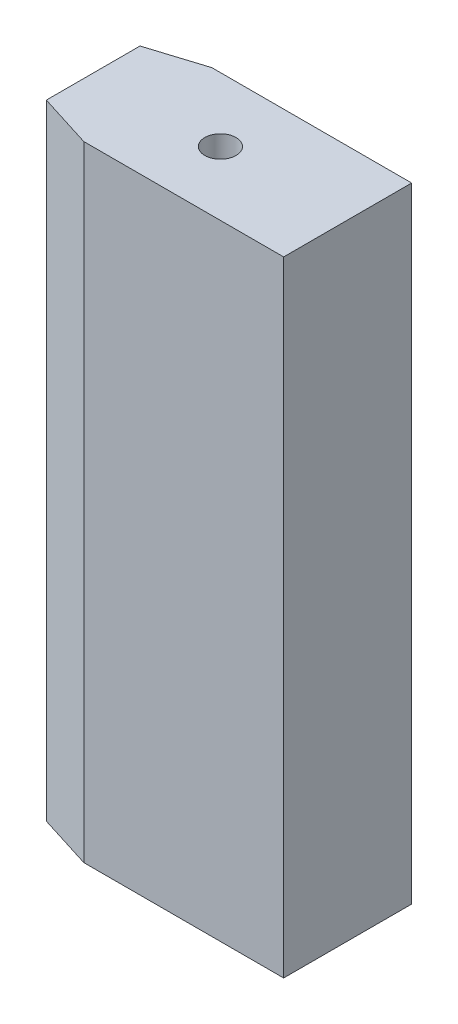
ISO-10303-21;
HEADER;
FILE_DESCRIPTION(('STEP AP214'),'2;1');
FILE_NAME('part.step','',(''),(''),'','','');
FILE_SCHEMA(('AUTOMOTIVE_DESIGN { 1 0 10303 214 1 1 1 1 }'));
ENDSEC;
DATA;
#1=APPLICATION_CONTEXT('core data for automotive mechanical design processes');
#2=APPLICATION_PROTOCOL_DEFINITION('international standard','automotive_design',2000,#1);
#3=PRODUCT_CONTEXT('',#1,'mechanical');
#4=PRODUCT('Part','Part','',(#3));
#5=PRODUCT_RELATED_PRODUCT_CATEGORY('part','',(#4));
#6=PRODUCT_DEFINITION_FORMATION('','',#4);
#7=PRODUCT_DEFINITION_CONTEXT('part definition',#1,'design');
#8=PRODUCT_DEFINITION('design','',#6,#7);
#9=PRODUCT_DEFINITION_SHAPE('','',#8);
#10=(LENGTH_UNIT() NAMED_UNIT(*) SI_UNIT(.MILLI.,.METRE.));
#11=(NAMED_UNIT(*) PLANE_ANGLE_UNIT() SI_UNIT($,.RADIAN.));
#12=(NAMED_UNIT(*) SI_UNIT($,.STERADIAN.) SOLID_ANGLE_UNIT());
#13=UNCERTAINTY_MEASURE_WITH_UNIT(LENGTH_MEASURE(1.E-05),#10,'distance_accuracy_value','');
#14=(GEOMETRIC_REPRESENTATION_CONTEXT(3) GLOBAL_UNCERTAINTY_ASSIGNED_CONTEXT((#13)) GLOBAL_UNIT_ASSIGNED_CONTEXT((#10,
#11,#12)) REPRESENTATION_CONTEXT('',''));
#15=CARTESIAN_POINT('',(0.,0.,0.));
#16=DIRECTION('',(0.,0.,1.));
#17=DIRECTION('',(1.,0.,0.));
#18=AXIS2_PLACEMENT_3D('',#15,#16,#17);
#19=CARTESIAN_POINT('',(-3.49613670133728,40.,-11.1240713224368));
#20=DIRECTION('',(-0.299826596740394,0.,-0.953993716901256));
#21=DIRECTION('',(-0.953993716901256,0.,0.299826596740394));
#22=AXIS2_PLACEMENT_3D('',#19,#20,#21);
#23=PLANE('',#22);
#24=DIRECTION('',(0.953993716901256,0.,-0.299826596740394));
#25=VECTOR('',#24,1.);
#26=CARTESIAN_POINT('',(-3.49613670133728,0.,-11.1240713224368));
#27=LINE('',#26,#25);
#28=CARTESIAN_POINT('',(-16.3,0.,-7.1));
#29=VERTEX_POINT('',#28);
#30=CARTESIAN_POINT('',(-12.8,0.,-8.2));
#31=VERTEX_POINT('',#30);
#32=EDGE_CURVE('E117',#29,#31,#27,.T.);
#33=ORIENTED_EDGE('',*,*,#32,.F.);
#34=DIRECTION('',(0.,-1.,0.));
#35=VECTOR('',#34,1.);
#36=CARTESIAN_POINT('',(-16.3,40.,-7.1));
#37=LINE('',#36,#35);
#38=CARTESIAN_POINT('',(-16.3,40.,-7.1));
#39=VERTEX_POINT('',#38);
#40=EDGE_CURVE('E11',#39,#29,#37,.T.);
#41=ORIENTED_EDGE('',*,*,#40,.F.);
#42=DIRECTION('',(0.953993716901256,0.,-0.299826596740394));
#43=VECTOR('',#42,1.);
#44=CARTESIAN_POINT('',(-3.49613670133728,40.,-11.1240713224368));
#45=LINE('',#44,#43);
#46=CARTESIAN_POINT('',(-12.8,40.,-8.2));
#47=VERTEX_POINT('',#46);
#48=EDGE_CURVE('E131',#39,#47,#45,.T.);
#49=ORIENTED_EDGE('',*,*,#48,.T.);
#50=DIRECTION('',(0.,-1.,0.));
#51=VECTOR('',#50,1.);
#52=CARTESIAN_POINT('',(-12.8,40.,-8.2));
#53=LINE('',#52,#51);
#54=EDGE_CURVE('E79',#47,#31,#53,.T.);
#55=ORIENTED_EDGE('',*,*,#54,.T.);
#56=EDGE_LOOP('',(#33,#41,#49,#55));
#57=FACE_BOUND('',#56,.T.);
#58=ADVANCED_FACE('F35',(#57),#23,.T.);
#59=CARTESIAN_POINT('',(-16.3,40.,0.));
#60=DIRECTION('',(-1.,0.,0.));
#61=DIRECTION('',(0.,0.,1.));
#62=AXIS2_PLACEMENT_3D('',#59,#60,#61);
#63=PLANE('',#62);
#64=DIRECTION('',(0.,0.,-1.));
#65=VECTOR('',#64,1.);
#66=CARTESIAN_POINT('',(-16.3,0.,0.));
#67=LINE('',#66,#65);
#68=CARTESIAN_POINT('',(-16.3,0.,-1.1));
#69=VERTEX_POINT('',#68);
#70=EDGE_CURVE('E120',#69,#29,#67,.T.);
#71=ORIENTED_EDGE('',*,*,#70,.F.);
#72=DIRECTION('',(0.,-1.,0.));
#73=VECTOR('',#72,1.);
#74=CARTESIAN_POINT('',(-16.3,40.,-1.1));
#75=LINE('',#74,#73);
#76=CARTESIAN_POINT('',(-16.3,40.,-1.1));
#77=VERTEX_POINT('',#76);
#78=EDGE_CURVE('E43',#77,#69,#75,.T.);
#79=ORIENTED_EDGE('',*,*,#78,.F.);
#80=DIRECTION('',(0.,0.,-1.));
#81=VECTOR('',#80,1.);
#82=CARTESIAN_POINT('',(-16.3,40.,0.));
#83=LINE('',#82,#81);
#84=EDGE_CURVE('E112',#77,#39,#83,.T.);
#85=ORIENTED_EDGE('',*,*,#84,.T.);
#86=ORIENTED_EDGE('',*,*,#40,.T.);
#87=EDGE_LOOP('',(#71,#79,#85,#86));
#88=FACE_BOUND('',#87,.T.);
#89=ADVANCED_FACE('F142',(#88),#63,.T.);
#90=CARTESIAN_POINT('',(-1.15066864784547,40.,3.66121842496285));
#91=DIRECTION('',(0.299826596740394,0.,-0.953993716901256));
#92=DIRECTION('',(-0.953993716901256,0.,-0.299826596740394));
#93=AXIS2_PLACEMENT_3D('',#90,#91,#92);
#94=PLANE('',#93);
#95=DIRECTION('',(0.953993716901256,0.,0.299826596740394));
#96=VECTOR('',#95,1.);
#97=CARTESIAN_POINT('',(-1.15066864784547,0.,3.66121842496285));
#98=LINE('',#97,#96);
#99=CARTESIAN_POINT('',(-12.8,0.,0.));
#100=VERTEX_POINT('',#99);
#101=EDGE_CURVE('E124',#69,#100,#98,.T.);
#102=ORIENTED_EDGE('',*,*,#101,.T.);
#103=DIRECTION('',(0.,-1.,0.));
#104=VECTOR('',#103,1.);
#105=CARTESIAN_POINT('',(-12.8,40.,0.));
#106=LINE('',#105,#104);
#107=CARTESIAN_POINT('',(-12.8,40.,0.));
#108=VERTEX_POINT('',#107);
#109=EDGE_CURVE('E100',#108,#100,#106,.T.);
#110=ORIENTED_EDGE('',*,*,#109,.F.);
#111=DIRECTION('',(0.953993716901256,0.,0.299826596740394));
#112=VECTOR('',#111,1.);
#113=CARTESIAN_POINT('',(-1.15066864784547,40.,3.66121842496285));
#114=LINE('',#113,#112);
#115=EDGE_CURVE('E109',#77,#108,#114,.T.);
#116=ORIENTED_EDGE('',*,*,#115,.F.);
#117=ORIENTED_EDGE('',*,*,#78,.T.);
#118=EDGE_LOOP('',(#102,#110,#116,#117));
#119=FACE_BOUND('',#118,.T.);
#120=ADVANCED_FACE('F136',(#119),#94,.F.);
#121=CARTESIAN_POINT('',(0.,40.,0.));
#122=DIRECTION('',(0.,0.,1.));
#123=DIRECTION('',(1.,0.,0.));
#124=AXIS2_PLACEMENT_3D('',#121,#122,#123);
#125=PLANE('',#124);
#126=DIRECTION('',(-1.,0.,0.));
#127=VECTOR('',#126,1.);
#128=CARTESIAN_POINT('',(0.,0.,0.));
#129=LINE('',#128,#127);
#130=CARTESIAN_POINT('',(0.,0.,0.));
#131=VERTEX_POINT('',#130);
#132=EDGE_CURVE('E99',#131,#100,#129,.T.);
#133=ORIENTED_EDGE('',*,*,#132,.F.);
#134=DIRECTION('',(0.,-1.,0.));
#135=VECTOR('',#134,1.);
#136=CARTESIAN_POINT('',(0.,40.,0.));
#137=LINE('',#136,#135);
#138=CARTESIAN_POINT('',(0.,40.,0.));
#139=VERTEX_POINT('',#138);
#140=EDGE_CURVE('E93',#139,#131,#137,.T.);
#141=ORIENTED_EDGE('',*,*,#140,.F.);
#142=DIRECTION('',(-1.,0.,0.));
#143=VECTOR('',#142,1.);
#144=CARTESIAN_POINT('',(0.,40.,0.));
#145=LINE('',#144,#143);
#146=EDGE_CURVE('E97',#139,#108,#145,.T.);
#147=ORIENTED_EDGE('',*,*,#146,.T.);
#148=ORIENTED_EDGE('',*,*,#109,.T.);
#149=EDGE_LOOP('',(#133,#141,#147,#148));
#150=FACE_BOUND('',#149,.T.);
#151=ADVANCED_FACE('F95',(#150),#125,.T.);
#152=CARTESIAN_POINT('',(0.,40.,0.));
#153=DIRECTION('',(-1.,0.,0.));
#154=DIRECTION('',(0.,0.,1.));
#155=AXIS2_PLACEMENT_3D('',#152,#153,#154);
#156=PLANE('',#155);
#157=DIRECTION('',(0.,0.,-1.));
#158=VECTOR('',#157,1.);
#159=CARTESIAN_POINT('',(0.,0.,0.));
#160=LINE('',#159,#158);
#161=CARTESIAN_POINT('',(0.,0.,-8.2));
#162=VERTEX_POINT('',#161);
#163=EDGE_CURVE('E72',#131,#162,#160,.T.);
#164=ORIENTED_EDGE('',*,*,#163,.T.);
#165=DIRECTION('',(0.,-1.,0.));
#166=VECTOR('',#165,1.);
#167=CARTESIAN_POINT('',(0.,40.,-8.2));
#168=LINE('',#167,#166);
#169=CARTESIAN_POINT('',(0.,40.,-8.2));
#170=VERTEX_POINT('',#169);
#171=EDGE_CURVE('E101',#170,#162,#168,.T.);
#172=ORIENTED_EDGE('',*,*,#171,.F.);
#173=DIRECTION('',(0.,0.,-1.));
#174=VECTOR('',#173,1.);
#175=CARTESIAN_POINT('',(0.,40.,0.));
#176=LINE('',#175,#174);
#177=EDGE_CURVE('E103',#139,#170,#176,.T.);
#178=ORIENTED_EDGE('',*,*,#177,.F.);
#179=ORIENTED_EDGE('',*,*,#140,.T.);
#180=EDGE_LOOP('',(#164,#172,#178,#179));
#181=FACE_BOUND('',#180,.T.);
#182=ADVANCED_FACE('F104',(#181),#156,.F.);
#183=CARTESIAN_POINT('',(0.,40.,-8.2));
#184=DIRECTION('',(0.,0.,1.));
#185=DIRECTION('',(1.,0.,0.));
#186=AXIS2_PLACEMENT_3D('',#183,#184,#185);
#187=PLANE('',#186);
#188=DIRECTION('',(-1.,0.,0.));
#189=VECTOR('',#188,1.);
#190=CARTESIAN_POINT('',(0.,0.,-8.2));
#191=LINE('',#190,#189);
#192=EDGE_CURVE('E129',#162,#31,#191,.T.);
#193=ORIENTED_EDGE('',*,*,#192,.T.);
#194=ORIENTED_EDGE('',*,*,#54,.F.);
#195=DIRECTION('',(-1.,0.,0.));
#196=VECTOR('',#195,1.);
#197=CARTESIAN_POINT('',(0.,40.,-8.2));
#198=LINE('',#197,#196);
#199=EDGE_CURVE('E51',#170,#47,#198,.T.);
#200=ORIENTED_EDGE('',*,*,#199,.F.);
#201=ORIENTED_EDGE('',*,*,#171,.T.);
#202=EDGE_LOOP('',(#193,#194,#200,#201));
#203=FACE_BOUND('',#202,.T.);
#204=ADVANCED_FACE('F145',(#203),#187,.F.);
#205=CARTESIAN_POINT('',(0.,40.,0.));
#206=DIRECTION('',(0.,1.,0.));
#207=DIRECTION('',(0.,0.,1.));
#208=AXIS2_PLACEMENT_3D('',#205,#206,#207);
#209=PLANE('',#208);
#210=CARTESIAN_POINT('',(-8.15,40.,-4.1));
#211=DIRECTION('',(0.,1.,0.));
#212=DIRECTION('',(0.,0.,1.));
#213=AXIS2_PLACEMENT_3D('',#210,#211,#212);
#214=CIRCLE('',#213,1.);
#215=CARTESIAN_POINT('',(-8.15,40.,-3.1));
#216=VERTEX_POINT('',#215);
#217=EDGE_CURVE('E148',#216,#216,#214,.T.);
#218=ORIENTED_EDGE('',*,*,#217,.F.);
#219=EDGE_LOOP('',(#218));
#220=FACE_BOUND('',#219,.T.);
#221=ORIENTED_EDGE('',*,*,#48,.F.);
#222=ORIENTED_EDGE('',*,*,#84,.F.);
#223=ORIENTED_EDGE('',*,*,#115,.T.);
#224=ORIENTED_EDGE('',*,*,#146,.F.);
#225=ORIENTED_EDGE('',*,*,#177,.T.);
#226=ORIENTED_EDGE('',*,*,#199,.T.);
#227=EDGE_LOOP('',(#221,#222,#223,#224,#225,#226));
#228=FACE_BOUND('',#227,.T.);
#229=ADVANCED_FACE('F106',(#220,#228),#209,.T.);
#230=CARTESIAN_POINT('',(0.,0.,0.));
#231=DIRECTION('',(0.,1.,0.));
#232=DIRECTION('',(0.,0.,1.));
#233=AXIS2_PLACEMENT_3D('',#230,#231,#232);
#234=PLANE('',#233);
#235=CARTESIAN_POINT('',(-8.15,0.,-4.1));
#236=DIRECTION('',(0.,1.,0.));
#237=DIRECTION('',(0.,0.,1.));
#238=AXIS2_PLACEMENT_3D('',#235,#236,#237);
#239=CIRCLE('',#238,1.);
#240=CARTESIAN_POINT('',(-8.15,0.,-3.1));
#241=VERTEX_POINT('',#240);
#242=EDGE_CURVE('E121',#241,#241,#239,.T.);
#243=ORIENTED_EDGE('',*,*,#242,.T.);
#244=EDGE_LOOP('',(#243));
#245=FACE_BOUND('',#244,.T.);
#246=ORIENTED_EDGE('',*,*,#32,.T.);
#247=ORIENTED_EDGE('',*,*,#192,.F.);
#248=ORIENTED_EDGE('',*,*,#163,.F.);
#249=ORIENTED_EDGE('',*,*,#132,.T.);
#250=ORIENTED_EDGE('',*,*,#101,.F.);
#251=ORIENTED_EDGE('',*,*,#70,.T.);
#252=EDGE_LOOP('',(#246,#247,#248,#249,#250,#251));
#253=FACE_BOUND('',#252,.T.);
#254=ADVANCED_FACE('F141',(#245,#253),#234,.F.);
#255=CARTESIAN_POINT('',(-8.15,0.,-4.1));
#256=DIRECTION('',(0.,1.,0.));
#257=DIRECTION('',(0.,0.,1.));
#258=AXIS2_PLACEMENT_3D('',#255,#256,#257);
#259=CYLINDRICAL_SURFACE('',#258,1.);
#260=ORIENTED_EDGE('',*,*,#242,.F.);
#261=EDGE_LOOP('',(#260));
#262=FACE_BOUND('',#261,.T.);
#263=ORIENTED_EDGE('',*,*,#217,.T.);
#264=EDGE_LOOP('',(#263));
#265=FACE_BOUND('',#264,.T.);
#266=ADVANCED_FACE('F155',(#262,#265),#259,.F.);
#267=CLOSED_SHELL('',(#58,#89,#120,#151,#182,#204,#229,#254,#266));
#268=MANIFOLD_SOLID_BREP('B2',#267);
#269=ADVANCED_BREP_SHAPE_REPRESENTATION('',(#18,#268),#14);
#270=SHAPE_DEFINITION_REPRESENTATION(#9,#269);
ENDSEC;
END-ISO-10303-21;
